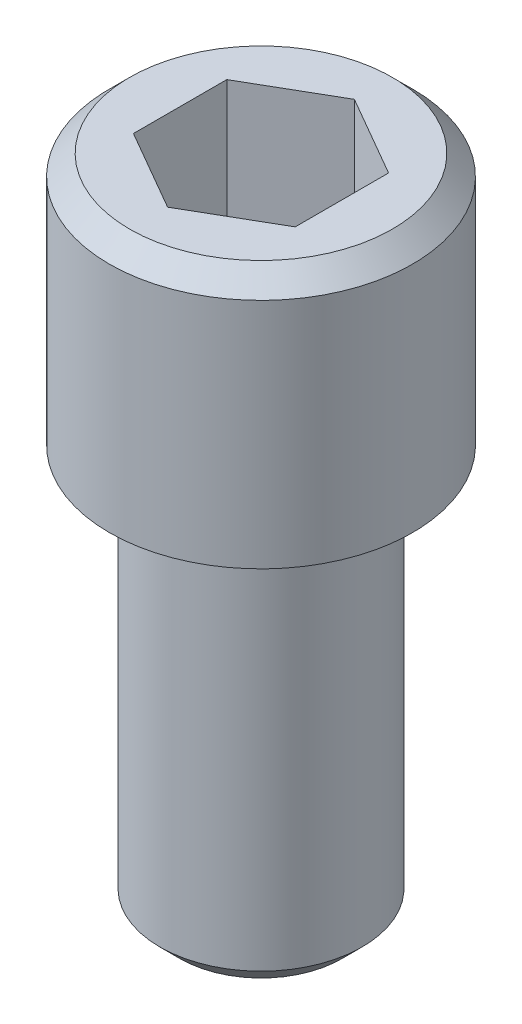
ISO-10303-21;
HEADER;
FILE_DESCRIPTION(('STEP AP214'),'2;1');
FILE_NAME('part.step','',(''),(''),'','','');
FILE_SCHEMA(('AUTOMOTIVE_DESIGN { 1 0 10303 214 1 1 1 1 }'));
ENDSEC;
DATA;
#1=APPLICATION_CONTEXT('core data for automotive mechanical design processes');
#2=APPLICATION_PROTOCOL_DEFINITION('international standard','automotive_design',2000,#1);
#3=PRODUCT_CONTEXT('',#1,'mechanical');
#4=PRODUCT('Part','Part','',(#3));
#5=PRODUCT_RELATED_PRODUCT_CATEGORY('part','',(#4));
#6=PRODUCT_DEFINITION_FORMATION('','',#4);
#7=PRODUCT_DEFINITION_CONTEXT('part definition',#1,'design');
#8=PRODUCT_DEFINITION('design','',#6,#7);
#9=PRODUCT_DEFINITION_SHAPE('','',#8);
#10=(LENGTH_UNIT() NAMED_UNIT(*) SI_UNIT(.MILLI.,.METRE.));
#11=(NAMED_UNIT(*) PLANE_ANGLE_UNIT() SI_UNIT($,.RADIAN.));
#12=(NAMED_UNIT(*) SI_UNIT($,.STERADIAN.) SOLID_ANGLE_UNIT());
#13=UNCERTAINTY_MEASURE_WITH_UNIT(LENGTH_MEASURE(1.E-05),#10,'distance_accuracy_value','');
#14=(GEOMETRIC_REPRESENTATION_CONTEXT(3) GLOBAL_UNCERTAINTY_ASSIGNED_CONTEXT((#13)) GLOBAL_UNIT_ASSIGNED_CONTEXT((#10,
#11,#12)) REPRESENTATION_CONTEXT('',''));
#15=CARTESIAN_POINT('',(0.,0.,0.));
#16=DIRECTION('',(0.,0.,1.));
#17=DIRECTION('',(1.,0.,0.));
#18=AXIS2_PLACEMENT_3D('',#15,#16,#17);
#19=CARTESIAN_POINT('',(0.,5.,0.));
#20=DIRECTION('',(0.,-1.,0.));
#21=DIRECTION('',(0.,0.,-1.));
#22=AXIS2_PLACEMENT_3D('',#19,#20,#21);
#23=CYLINDRICAL_SURFACE('',#22,1.25);
#24=CARTESIAN_POINT('',(0.,0.250000000000001,0.));
#25=DIRECTION('',(0.,1.,0.));
#26=DIRECTION('',(0.,0.,1.));
#27=AXIS2_PLACEMENT_3D('',#24,#25,#26);
#28=CIRCLE('',#27,1.25);
#29=CARTESIAN_POINT('',(0.,0.250000000000001,1.25));
#30=VERTEX_POINT('',#29);
#31=EDGE_CURVE('E146',#30,#30,#28,.T.);
#32=ORIENTED_EDGE('',*,*,#31,.T.);
#33=EDGE_LOOP('',(#32));
#34=FACE_BOUND('',#33,.T.);
#35=CARTESIAN_POINT('',(0.,5.,0.));
#36=DIRECTION('',(0.,1.,0.));
#37=DIRECTION('',(0.,0.,1.));
#38=AXIS2_PLACEMENT_3D('',#35,#36,#37);
#39=CIRCLE('',#38,1.25);
#40=CARTESIAN_POINT('',(0.,5.,1.25));
#41=VERTEX_POINT('',#40);
#42=EDGE_CURVE('E143',#41,#41,#39,.T.);
#43=ORIENTED_EDGE('',*,*,#42,.F.);
#44=EDGE_LOOP('',(#43));
#45=FACE_BOUND('',#44,.T.);
#46=ADVANCED_FACE('F33',(#34,#45),#23,.T.);
#47=CARTESIAN_POINT('',(0.,0.,0.));
#48=DIRECTION('',(0.,1.,0.));
#49=DIRECTION('',(0.,0.,1.));
#50=AXIS2_PLACEMENT_3D('',#47,#48,#49);
#51=PLANE('',#50);
#52=CARTESIAN_POINT('',(0.,0.,0.));
#53=DIRECTION('',(0.,1.,0.));
#54=DIRECTION('',(0.,0.,1.));
#55=AXIS2_PLACEMENT_3D('',#52,#53,#54);
#56=CIRCLE('',#55,0.999999999999998);
#57=CARTESIAN_POINT('',(0.,0.,0.999999999999998));
#58=VERTEX_POINT('',#57);
#59=EDGE_CURVE('E149',#58,#58,#56,.F.);
#60=ORIENTED_EDGE('',*,*,#59,.T.);
#61=EDGE_LOOP('',(#60));
#62=FACE_BOUND('',#61,.T.);
#63=ADVANCED_FACE('F166',(#62),#51,.F.);
#64=CARTESIAN_POINT('',(0.,8.125,0.));
#65=DIRECTION('',(0.,-1.,0.));
#66=DIRECTION('',(0.,0.,-1.));
#67=AXIS2_PLACEMENT_3D('',#64,#65,#66);
#68=CYLINDRICAL_SURFACE('',#67,1.875);
#69=CARTESIAN_POINT('',(0.,7.875,0.));
#70=DIRECTION('',(0.,1.,0.));
#71=DIRECTION('',(0.,0.,1.));
#72=AXIS2_PLACEMENT_3D('',#69,#70,#71);
#73=CIRCLE('',#72,1.875);
#74=CARTESIAN_POINT('',(0.,7.875,1.875));
#75=VERTEX_POINT('',#74);
#76=EDGE_CURVE('E11',#75,#75,#73,.F.);
#77=ORIENTED_EDGE('',*,*,#76,.T.);
#78=EDGE_LOOP('',(#77));
#79=FACE_BOUND('',#78,.T.);
#80=CARTESIAN_POINT('',(0.,5.,0.));
#81=DIRECTION('',(0.,1.,0.));
#82=DIRECTION('',(0.,0.,1.));
#83=AXIS2_PLACEMENT_3D('',#80,#81,#82);
#84=CIRCLE('',#83,1.875);
#85=CARTESIAN_POINT('',(0.,5.,1.875));
#86=VERTEX_POINT('',#85);
#87=EDGE_CURVE('E135',#86,#86,#84,.T.);
#88=ORIENTED_EDGE('',*,*,#87,.T.);
#89=EDGE_LOOP('',(#88));
#90=FACE_BOUND('',#89,.T.);
#91=ADVANCED_FACE('F172',(#79,#90),#68,.T.);
#92=CARTESIAN_POINT('',(0.,8.125,0.));
#93=DIRECTION('',(0.,1.,0.));
#94=DIRECTION('',(0.,0.,1.));
#95=AXIS2_PLACEMENT_3D('',#92,#93,#94);
#96=PLANE('',#95);
#97=CARTESIAN_POINT('',(0.,8.125,0.));
#98=DIRECTION('',(0.,1.,0.));
#99=DIRECTION('',(0.,0.,1.));
#100=AXIS2_PLACEMENT_3D('',#97,#98,#99);
#101=CIRCLE('',#100,1.625);
#102=CARTESIAN_POINT('',(0.,8.125,1.625));
#103=VERTEX_POINT('',#102);
#104=EDGE_CURVE('E41',#103,#103,#101,.T.);
#105=ORIENTED_EDGE('',*,*,#104,.T.);
#106=EDGE_LOOP('',(#105));
#107=FACE_BOUND('',#106,.T.);
#108=DIRECTION('',(-0.866025403784439,0.,-0.5));
#109=VECTOR('',#108,1.);
#110=CARTESIAN_POINT('',(0.999999999999999,8.125,-0.577350269189627));
#111=LINE('',#110,#109);
#112=CARTESIAN_POINT('',(0.999999999999999,8.125,-0.577350269189627));
#113=VERTEX_POINT('',#112);
#114=CARTESIAN_POINT('',(0.,8.125,-1.15470053837925));
#115=VERTEX_POINT('',#114);
#116=EDGE_CURVE('E48',#113,#115,#111,.T.);
#117=ORIENTED_EDGE('',*,*,#116,.F.);
#118=DIRECTION('',(0.,0.,-1.));
#119=VECTOR('',#118,1.);
#120=CARTESIAN_POINT('',(1.,8.125,0.577350269189626));
#121=LINE('',#120,#119);
#122=CARTESIAN_POINT('',(1.,8.125,0.577350269189626));
#123=VERTEX_POINT('',#122);
#124=EDGE_CURVE('E131',#123,#113,#121,.T.);
#125=ORIENTED_EDGE('',*,*,#124,.F.);
#126=DIRECTION('',(0.866025403784439,0.,-0.5));
#127=VECTOR('',#126,1.);
#128=CARTESIAN_POINT('',(0.,8.125,1.15470053837925));
#129=LINE('',#128,#127);
#130=CARTESIAN_POINT('',(0.,8.125,1.15470053837925));
#131=VERTEX_POINT('',#130);
#132=EDGE_CURVE('E129',#131,#123,#129,.T.);
#133=ORIENTED_EDGE('',*,*,#132,.F.);
#134=DIRECTION('',(0.866025403784439,0.,0.5));
#135=VECTOR('',#134,1.);
#136=CARTESIAN_POINT('',(-1.,8.125,0.577350269189626));
#137=LINE('',#136,#135);
#138=CARTESIAN_POINT('',(-1.,8.125,0.577350269189626));
#139=VERTEX_POINT('',#138);
#140=EDGE_CURVE('E96',#139,#131,#137,.T.);
#141=ORIENTED_EDGE('',*,*,#140,.F.);
#142=DIRECTION('',(0.,0.,1.));
#143=VECTOR('',#142,1.);
#144=CARTESIAN_POINT('',(-1.,8.125,-0.577350269189626));
#145=LINE('',#144,#143);
#146=CARTESIAN_POINT('',(-1.,8.125,-0.577350269189626));
#147=VERTEX_POINT('',#146);
#148=EDGE_CURVE('E125',#147,#139,#145,.T.);
#149=ORIENTED_EDGE('',*,*,#148,.F.);
#150=DIRECTION('',(-0.866025403784439,0.,0.5));
#151=VECTOR('',#150,1.);
#152=CARTESIAN_POINT('',(0.,8.125,-1.15470053837925));
#153=LINE('',#152,#151);
#154=EDGE_CURVE('E122',#115,#147,#153,.T.);
#155=ORIENTED_EDGE('',*,*,#154,.F.);
#156=EDGE_LOOP('',(#117,#125,#133,#141,#149,#155));
#157=FACE_BOUND('',#156,.T.);
#158=ADVANCED_FACE('F154',(#107,#157),#96,.T.);
#159=CARTESIAN_POINT('',(0.,5.,0.));
#160=DIRECTION('',(0.,1.,0.));
#161=DIRECTION('',(0.,0.,1.));
#162=AXIS2_PLACEMENT_3D('',#159,#160,#161);
#163=PLANE('',#162);
#164=ORIENTED_EDGE('',*,*,#42,.T.);
#165=EDGE_LOOP('',(#164));
#166=FACE_BOUND('',#165,.T.);
#167=ORIENTED_EDGE('',*,*,#87,.F.);
#168=EDGE_LOOP('',(#167));
#169=FACE_BOUND('',#168,.T.);
#170=ADVANCED_FACE('F180',(#166,#169),#163,.F.);
#171=CARTESIAN_POINT('',(0.999999999999999,6.25,-0.577350269189627));
#172=DIRECTION('',(0.5,0.,-0.866025403784439));
#173=DIRECTION('',(-0.866025403784439,0.,-0.5));
#174=AXIS2_PLACEMENT_3D('',#171,#172,#173);
#175=PLANE('',#174);
#176=ORIENTED_EDGE('',*,*,#116,.T.);
#177=DIRECTION('',(0.,1.,0.));
#178=VECTOR('',#177,1.);
#179=CARTESIAN_POINT('',(0.,6.25,-1.15470053837925));
#180=LINE('',#179,#178);
#181=CARTESIAN_POINT('',(0.,6.25,-1.15470053837925));
#182=VERTEX_POINT('',#181);
#183=EDGE_CURVE('E78',#182,#115,#180,.T.);
#184=ORIENTED_EDGE('',*,*,#183,.F.);
#185=DIRECTION('',(-0.866025403784439,0.,-0.5));
#186=VECTOR('',#185,1.);
#187=CARTESIAN_POINT('',(0.999999999999999,6.25,-0.577350269189627));
#188=LINE('',#187,#186);
#189=CARTESIAN_POINT('',(0.999999999999999,6.25,-0.577350269189627));
#190=VERTEX_POINT('',#189);
#191=EDGE_CURVE('E133',#190,#182,#188,.T.);
#192=ORIENTED_EDGE('',*,*,#191,.F.);
#193=DIRECTION('',(0.,1.,0.));
#194=VECTOR('',#193,1.);
#195=CARTESIAN_POINT('',(0.999999999999999,6.25,-0.577350269189627));
#196=LINE('',#195,#194);
#197=EDGE_CURVE('E56',#190,#113,#196,.T.);
#198=ORIENTED_EDGE('',*,*,#197,.T.);
#199=EDGE_LOOP('',(#176,#184,#192,#198));
#200=FACE_BOUND('',#199,.T.);
#201=ADVANCED_FACE('F183',(#200),#175,.F.);
#202=CARTESIAN_POINT('',(1.,6.25,0.577350269189626));
#203=DIRECTION('',(1.,0.,0.));
#204=DIRECTION('',(0.,0.,-1.));
#205=AXIS2_PLACEMENT_3D('',#202,#203,#204);
#206=PLANE('',#205);
#207=ORIENTED_EDGE('',*,*,#124,.T.);
#208=ORIENTED_EDGE('',*,*,#197,.F.);
#209=DIRECTION('',(0.,0.,-1.));
#210=VECTOR('',#209,1.);
#211=CARTESIAN_POINT('',(1.,6.25,0.577350269189626));
#212=LINE('',#211,#210);
#213=CARTESIAN_POINT('',(1.,6.25,0.577350269189626));
#214=VERTEX_POINT('',#213);
#215=EDGE_CURVE('E108',#214,#190,#212,.T.);
#216=ORIENTED_EDGE('',*,*,#215,.F.);
#217=DIRECTION('',(0.,1.,0.));
#218=VECTOR('',#217,1.);
#219=CARTESIAN_POINT('',(1.,6.25,0.577350269189626));
#220=LINE('',#219,#218);
#221=EDGE_CURVE('E100',#214,#123,#220,.T.);
#222=ORIENTED_EDGE('',*,*,#221,.T.);
#223=EDGE_LOOP('',(#207,#208,#216,#222));
#224=FACE_BOUND('',#223,.T.);
#225=ADVANCED_FACE('F189',(#224),#206,.F.);
#226=CARTESIAN_POINT('',(0.,6.25,1.15470053837925));
#227=DIRECTION('',(0.5,0.,0.866025403784439));
#228=DIRECTION('',(0.866025403784439,0.,-0.5));
#229=AXIS2_PLACEMENT_3D('',#226,#227,#228);
#230=PLANE('',#229);
#231=ORIENTED_EDGE('',*,*,#132,.T.);
#232=ORIENTED_EDGE('',*,*,#221,.F.);
#233=DIRECTION('',(0.866025403784439,0.,-0.5));
#234=VECTOR('',#233,1.);
#235=CARTESIAN_POINT('',(0.,6.25,1.15470053837925));
#236=LINE('',#235,#234);
#237=CARTESIAN_POINT('',(0.,6.25,1.15470053837925));
#238=VERTEX_POINT('',#237);
#239=EDGE_CURVE('E104',#238,#214,#236,.T.);
#240=ORIENTED_EDGE('',*,*,#239,.F.);
#241=DIRECTION('',(0.,1.,0.));
#242=VECTOR('',#241,1.);
#243=CARTESIAN_POINT('',(0.,6.25,1.15470053837925));
#244=LINE('',#243,#242);
#245=EDGE_CURVE('E89',#238,#131,#244,.T.);
#246=ORIENTED_EDGE('',*,*,#245,.T.);
#247=EDGE_LOOP('',(#231,#232,#240,#246));
#248=FACE_BOUND('',#247,.T.);
#249=ADVANCED_FACE('F105',(#248),#230,.F.);
#250=CARTESIAN_POINT('',(-1.,6.25,0.577350269189626));
#251=DIRECTION('',(-0.5,0.,0.866025403784439));
#252=DIRECTION('',(0.866025403784439,0.,0.5));
#253=AXIS2_PLACEMENT_3D('',#250,#251,#252);
#254=PLANE('',#253);
#255=ORIENTED_EDGE('',*,*,#140,.T.);
#256=ORIENTED_EDGE('',*,*,#245,.F.);
#257=DIRECTION('',(0.866025403784439,0.,0.5));
#258=VECTOR('',#257,1.);
#259=CARTESIAN_POINT('',(-1.,6.25,0.577350269189626));
#260=LINE('',#259,#258);
#261=CARTESIAN_POINT('',(-1.,6.25,0.577350269189626));
#262=VERTEX_POINT('',#261);
#263=EDGE_CURVE('E93',#262,#238,#260,.T.);
#264=ORIENTED_EDGE('',*,*,#263,.F.);
#265=DIRECTION('',(0.,1.,0.));
#266=VECTOR('',#265,1.);
#267=CARTESIAN_POINT('',(-1.,6.25,0.577350269189626));
#268=LINE('',#267,#266);
#269=EDGE_CURVE('E101',#262,#139,#268,.T.);
#270=ORIENTED_EDGE('',*,*,#269,.T.);
#271=EDGE_LOOP('',(#255,#256,#264,#270));
#272=FACE_BOUND('',#271,.T.);
#273=ADVANCED_FACE('F91',(#272),#254,.F.);
#274=CARTESIAN_POINT('',(-1.,6.25,-0.577350269189626));
#275=DIRECTION('',(-1.,0.,0.));
#276=DIRECTION('',(0.,0.,1.));
#277=AXIS2_PLACEMENT_3D('',#274,#275,#276);
#278=PLANE('',#277);
#279=ORIENTED_EDGE('',*,*,#148,.T.);
#280=ORIENTED_EDGE('',*,*,#269,.F.);
#281=DIRECTION('',(0.,0.,1.));
#282=VECTOR('',#281,1.);
#283=CARTESIAN_POINT('',(-1.,6.25,-0.577350269189626));
#284=LINE('',#283,#282);
#285=CARTESIAN_POINT('',(-1.,6.25,-0.577350269189626));
#286=VERTEX_POINT('',#285);
#287=EDGE_CURVE('E114',#286,#262,#284,.T.);
#288=ORIENTED_EDGE('',*,*,#287,.F.);
#289=DIRECTION('',(0.,1.,0.));
#290=VECTOR('',#289,1.);
#291=CARTESIAN_POINT('',(-1.,6.25,-0.577350269189626));
#292=LINE('',#291,#290);
#293=EDGE_CURVE('E138',#286,#147,#292,.T.);
#294=ORIENTED_EDGE('',*,*,#293,.T.);
#295=EDGE_LOOP('',(#279,#280,#288,#294));
#296=FACE_BOUND('',#295,.T.);
#297=ADVANCED_FACE('F193',(#296),#278,.F.);
#298=CARTESIAN_POINT('',(0.,6.25,-1.15470053837925));
#299=DIRECTION('',(-0.5,0.,-0.866025403784439));
#300=DIRECTION('',(-0.866025403784439,0.,0.5));
#301=AXIS2_PLACEMENT_3D('',#298,#299,#300);
#302=PLANE('',#301);
#303=ORIENTED_EDGE('',*,*,#154,.T.);
#304=ORIENTED_EDGE('',*,*,#293,.F.);
#305=DIRECTION('',(-0.866025403784439,0.,0.5));
#306=VECTOR('',#305,1.);
#307=CARTESIAN_POINT('',(0.,6.25,-1.15470053837925));
#308=LINE('',#307,#306);
#309=EDGE_CURVE('E116',#182,#286,#308,.T.);
#310=ORIENTED_EDGE('',*,*,#309,.F.);
#311=ORIENTED_EDGE('',*,*,#183,.T.);
#312=EDGE_LOOP('',(#303,#304,#310,#311));
#313=FACE_BOUND('',#312,.T.);
#314=ADVANCED_FACE('F190',(#313),#302,.F.);
#315=CARTESIAN_POINT('',(0.,6.25,0.));
#316=DIRECTION('',(0.,1.,0.));
#317=DIRECTION('',(0.,0.,1.));
#318=AXIS2_PLACEMENT_3D('',#315,#316,#317);
#319=PLANE('',#318);
#320=ORIENTED_EDGE('',*,*,#191,.T.);
#321=ORIENTED_EDGE('',*,*,#309,.T.);
#322=ORIENTED_EDGE('',*,*,#287,.T.);
#323=ORIENTED_EDGE('',*,*,#263,.T.);
#324=ORIENTED_EDGE('',*,*,#239,.T.);
#325=ORIENTED_EDGE('',*,*,#215,.T.);
#326=EDGE_LOOP('',(#320,#321,#322,#323,#324,#325));
#327=FACE_BOUND('',#326,.T.);
#328=ADVANCED_FACE('F111',(#327),#319,.T.);
#329=CARTESIAN_POINT('',(0.,0.250000000000001,0.));
#330=DIRECTION('',(0.,1.,0.));
#331=DIRECTION('',(0.,0.,1.));
#332=AXIS2_PLACEMENT_3D('',#329,#330,#331);
#333=CONICAL_SURFACE('',#332,1.25,0.785398163397449);
#334=ORIENTED_EDGE('',*,*,#59,.F.);
#335=EDGE_LOOP('',(#334));
#336=FACE_BOUND('',#335,.T.);
#337=ORIENTED_EDGE('',*,*,#31,.F.);
#338=EDGE_LOOP('',(#337));
#339=FACE_BOUND('',#338,.T.);
#340=ADVANCED_FACE('F158',(#336,#339),#333,.T.);
#341=CARTESIAN_POINT('',(0.,8.125,0.));
#342=DIRECTION('',(0.,-1.,0.));
#343=DIRECTION('',(0.,0.,-1.));
#344=AXIS2_PLACEMENT_3D('',#341,#342,#343);
#345=CONICAL_SURFACE('',#344,1.625,0.78539816339745);
#346=ORIENTED_EDGE('',*,*,#76,.F.);
#347=EDGE_LOOP('',(#346));
#348=FACE_BOUND('',#347,.T.);
#349=ORIENTED_EDGE('',*,*,#104,.F.);
#350=EDGE_LOOP('',(#349));
#351=FACE_BOUND('',#350,.T.);
#352=ADVANCED_FACE('F35',(#348,#351),#345,.T.);
#353=CLOSED_SHELL('',(#46,#63,#91,#158,#170,#201,#225,#249,#273,#297,#314,#328,#340,#352));
#354=MANIFOLD_SOLID_BREP('B2',#353);
#355=ADVANCED_BREP_SHAPE_REPRESENTATION('',(#18,#354),#14);
#356=SHAPE_DEFINITION_REPRESENTATION(#9,#355);
ENDSEC;
END-ISO-10303-21;
